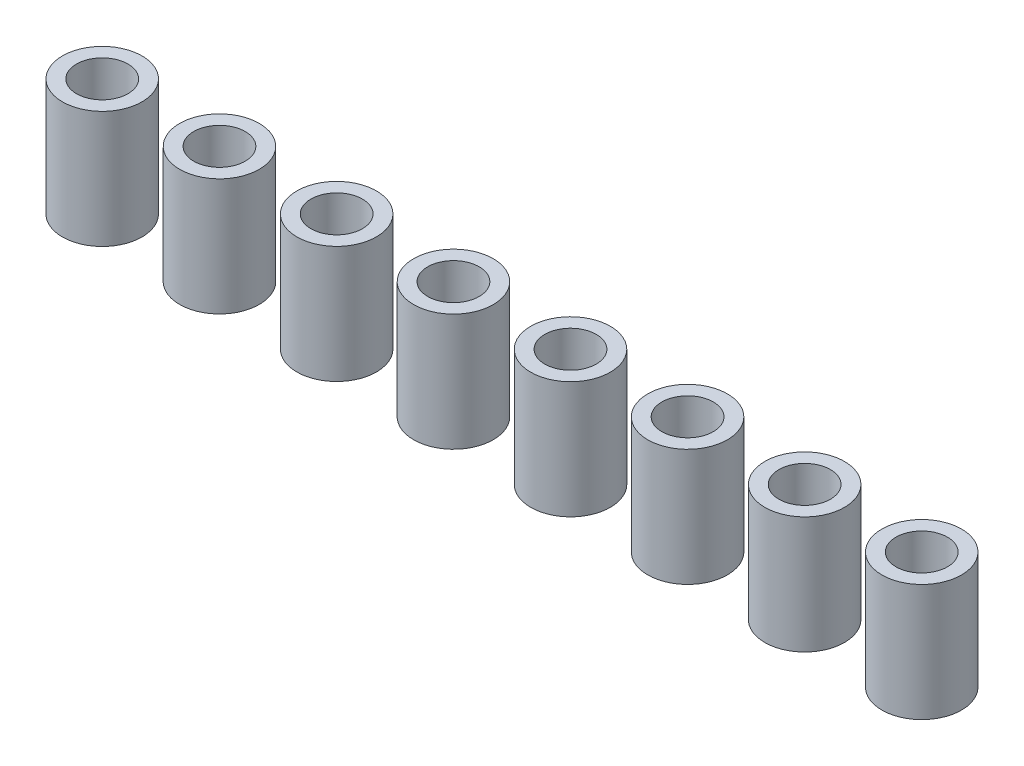
ISO-10303-21;
HEADER;
FILE_DESCRIPTION(('STEP AP214'),'2;1');
FILE_NAME('part.step','',(''),(''),'','','');
FILE_SCHEMA(('AUTOMOTIVE_DESIGN { 1 0 10303 214 1 1 1 1 }'));
ENDSEC;
DATA;
#1=APPLICATION_CONTEXT('core data for automotive mechanical design processes');
#2=APPLICATION_PROTOCOL_DEFINITION('international standard','automotive_design',2000,#1);
#3=PRODUCT_CONTEXT('',#1,'mechanical');
#4=PRODUCT('Part','Part','',(#3));
#5=PRODUCT_RELATED_PRODUCT_CATEGORY('part','',(#4));
#6=PRODUCT_DEFINITION_FORMATION('','',#4);
#7=PRODUCT_DEFINITION_CONTEXT('part definition',#1,'design');
#8=PRODUCT_DEFINITION('design','',#6,#7);
#9=PRODUCT_DEFINITION_SHAPE('','',#8);
#10=(LENGTH_UNIT() NAMED_UNIT(*) SI_UNIT(.MILLI.,.METRE.));
#11=(NAMED_UNIT(*) PLANE_ANGLE_UNIT() SI_UNIT($,.RADIAN.));
#12=(NAMED_UNIT(*) SI_UNIT($,.STERADIAN.) SOLID_ANGLE_UNIT());
#13=UNCERTAINTY_MEASURE_WITH_UNIT(LENGTH_MEASURE(1.E-05),#10,'distance_accuracy_value','');
#14=(GEOMETRIC_REPRESENTATION_CONTEXT(3) GLOBAL_UNCERTAINTY_ASSIGNED_CONTEXT((#13)) GLOBAL_UNIT_ASSIGNED_CONTEXT((#10,
#11,#12)) REPRESENTATION_CONTEXT('',''));
#15=CARTESIAN_POINT('',(0.,0.,0.));
#16=DIRECTION('',(0.,0.,1.));
#17=DIRECTION('',(1.,0.,0.));
#18=AXIS2_PLACEMENT_3D('',#15,#16,#17);
#19=CARTESIAN_POINT('',(35.,5.,0.));
#20=DIRECTION('',(0.,1.,0.));
#21=DIRECTION('',(0.,0.,1.));
#22=AXIS2_PLACEMENT_3D('',#19,#20,#21);
#23=PLANE('',#22);
#24=CARTESIAN_POINT('',(35.,5.,0.));
#25=DIRECTION('',(0.,1.,0.));
#26=DIRECTION('',(0.,0.,1.));
#27=AXIS2_PLACEMENT_3D('',#24,#25,#26);
#28=CIRCLE('',#27,1.7);
#29=CARTESIAN_POINT('',(35.,5.,1.7));
#30=VERTEX_POINT('',#29);
#31=EDGE_CURVE('E69',#30,#30,#28,.T.);
#32=ORIENTED_EDGE('',*,*,#31,.T.);
#33=EDGE_LOOP('',(#32));
#34=FACE_BOUND('',#33,.T.);
#35=CARTESIAN_POINT('',(35.,5.,0.));
#36=DIRECTION('',(0.,1.,0.));
#37=DIRECTION('',(0.,0.,1.));
#38=AXIS2_PLACEMENT_3D('',#35,#36,#37);
#39=CIRCLE('',#38,1.1);
#40=CARTESIAN_POINT('',(35.,5.,1.1));
#41=VERTEX_POINT('',#40);
#42=EDGE_CURVE('E56',#41,#41,#39,.T.);
#43=ORIENTED_EDGE('',*,*,#42,.F.);
#44=EDGE_LOOP('',(#43));
#45=FACE_BOUND('',#44,.T.);
#46=ADVANCED_FACE('F52',(#34,#45),#23,.T.);
#47=CARTESIAN_POINT('',(35.,0.,0.));
#48=DIRECTION('',(0.,1.,0.));
#49=DIRECTION('',(0.,0.,1.));
#50=AXIS2_PLACEMENT_3D('',#47,#48,#49);
#51=PLANE('',#50);
#52=CARTESIAN_POINT('',(35.,0.,0.));
#53=DIRECTION('',(0.,1.,0.));
#54=DIRECTION('',(0.,0.,1.));
#55=AXIS2_PLACEMENT_3D('',#52,#53,#54);
#56=CIRCLE('',#55,1.7);
#57=CARTESIAN_POINT('',(35.,0.,1.7));
#58=VERTEX_POINT('',#57);
#59=EDGE_CURVE('E67',#58,#58,#56,.T.);
#60=ORIENTED_EDGE('',*,*,#59,.F.);
#61=EDGE_LOOP('',(#60));
#62=FACE_BOUND('',#61,.T.);
#63=CARTESIAN_POINT('',(35.,0.,0.));
#64=DIRECTION('',(0.,1.,0.));
#65=DIRECTION('',(0.,0.,1.));
#66=AXIS2_PLACEMENT_3D('',#63,#64,#65);
#67=CIRCLE('',#66,1.1);
#68=CARTESIAN_POINT('',(35.,0.,1.1));
#69=VERTEX_POINT('',#68);
#70=EDGE_CURVE('E11',#69,#69,#67,.T.);
#71=ORIENTED_EDGE('',*,*,#70,.T.);
#72=EDGE_LOOP('',(#71));
#73=FACE_BOUND('',#72,.T.);
#74=ADVANCED_FACE('F77',(#62,#73),#51,.F.);
#75=CARTESIAN_POINT('',(35.,5.,0.));
#76=DIRECTION('',(0.,-1.,0.));
#77=DIRECTION('',(0.,0.,-1.));
#78=AXIS2_PLACEMENT_3D('',#75,#76,#77);
#79=CYLINDRICAL_SURFACE('',#78,1.7);
#80=ORIENTED_EDGE('',*,*,#31,.F.);
#81=EDGE_LOOP('',(#80));
#82=FACE_BOUND('',#81,.T.);
#83=ORIENTED_EDGE('',*,*,#59,.T.);
#84=EDGE_LOOP('',(#83));
#85=FACE_BOUND('',#84,.T.);
#86=ADVANCED_FACE('F75',(#82,#85),#79,.T.);
#87=CARTESIAN_POINT('',(35.,5.,0.));
#88=DIRECTION('',(0.,-1.,0.));
#89=DIRECTION('',(0.,0.,-1.));
#90=AXIS2_PLACEMENT_3D('',#87,#88,#89);
#91=CYLINDRICAL_SURFACE('',#90,1.1);
#92=ORIENTED_EDGE('',*,*,#42,.T.);
#93=EDGE_LOOP('',(#92));
#94=FACE_BOUND('',#93,.T.);
#95=ORIENTED_EDGE('',*,*,#70,.F.);
#96=EDGE_LOOP('',(#95));
#97=FACE_BOUND('',#96,.T.);
#98=ADVANCED_FACE('F54',(#94,#97),#91,.F.);
#99=CLOSED_SHELL('',(#46,#74,#86,#98));
#100=MANIFOLD_SOLID_BREP('B2',#99);
#101=CARTESIAN_POINT('',(30.,5.,0.));
#102=DIRECTION('',(0.,1.,0.));
#103=DIRECTION('',(0.,0.,1.));
#104=AXIS2_PLACEMENT_3D('',#101,#102,#103);
#105=PLANE('',#104);
#106=CARTESIAN_POINT('',(30.,5.,0.));
#107=DIRECTION('',(0.,1.,0.));
#108=DIRECTION('',(0.,0.,1.));
#109=AXIS2_PLACEMENT_3D('',#106,#107,#108);
#110=CIRCLE('',#109,1.7);
#111=CARTESIAN_POINT('',(30.,5.,1.7));
#112=VERTEX_POINT('',#111);
#113=EDGE_CURVE('E154',#112,#112,#110,.T.);
#114=ORIENTED_EDGE('',*,*,#113,.T.);
#115=EDGE_LOOP('',(#114));
#116=FACE_BOUND('',#115,.T.);
#117=CARTESIAN_POINT('',(30.,5.,0.));
#118=DIRECTION('',(0.,1.,0.));
#119=DIRECTION('',(0.,0.,1.));
#120=AXIS2_PLACEMENT_3D('',#117,#118,#119);
#121=CIRCLE('',#120,1.1);
#122=CARTESIAN_POINT('',(30.,5.,1.1));
#123=VERTEX_POINT('',#122);
#124=EDGE_CURVE('E142',#123,#123,#121,.T.);
#125=ORIENTED_EDGE('',*,*,#124,.F.);
#126=EDGE_LOOP('',(#125));
#127=FACE_BOUND('',#126,.T.);
#128=ADVANCED_FACE('F138',(#116,#127),#105,.T.);
#129=CARTESIAN_POINT('',(30.,0.,0.));
#130=DIRECTION('',(0.,1.,0.));
#131=DIRECTION('',(0.,0.,1.));
#132=AXIS2_PLACEMENT_3D('',#129,#130,#131);
#133=PLANE('',#132);
#134=CARTESIAN_POINT('',(30.,0.,0.));
#135=DIRECTION('',(0.,1.,0.));
#136=DIRECTION('',(0.,0.,1.));
#137=AXIS2_PLACEMENT_3D('',#134,#135,#136);
#138=CIRCLE('',#137,1.7);
#139=CARTESIAN_POINT('',(30.,0.,1.7));
#140=VERTEX_POINT('',#139);
#141=EDGE_CURVE('E152',#140,#140,#138,.T.);
#142=ORIENTED_EDGE('',*,*,#141,.F.);
#143=EDGE_LOOP('',(#142));
#144=FACE_BOUND('',#143,.T.);
#145=CARTESIAN_POINT('',(30.,0.,0.));
#146=DIRECTION('',(0.,1.,0.));
#147=DIRECTION('',(0.,0.,1.));
#148=AXIS2_PLACEMENT_3D('',#145,#146,#147);
#149=CIRCLE('',#148,1.1);
#150=CARTESIAN_POINT('',(30.,0.,1.1));
#151=VERTEX_POINT('',#150);
#152=EDGE_CURVE('E51',#151,#151,#149,.T.);
#153=ORIENTED_EDGE('',*,*,#152,.T.);
#154=EDGE_LOOP('',(#153));
#155=FACE_BOUND('',#154,.T.);
#156=ADVANCED_FACE('F163',(#144,#155),#133,.F.);
#157=CARTESIAN_POINT('',(30.,5.,0.));
#158=DIRECTION('',(0.,-1.,0.));
#159=DIRECTION('',(0.,0.,-1.));
#160=AXIS2_PLACEMENT_3D('',#157,#158,#159);
#161=CYLINDRICAL_SURFACE('',#160,1.7);
#162=ORIENTED_EDGE('',*,*,#113,.F.);
#163=EDGE_LOOP('',(#162));
#164=FACE_BOUND('',#163,.T.);
#165=ORIENTED_EDGE('',*,*,#141,.T.);
#166=EDGE_LOOP('',(#165));
#167=FACE_BOUND('',#166,.T.);
#168=ADVANCED_FACE('F161',(#164,#167),#161,.T.);
#169=CARTESIAN_POINT('',(30.,5.,0.));
#170=DIRECTION('',(0.,-1.,0.));
#171=DIRECTION('',(0.,0.,-1.));
#172=AXIS2_PLACEMENT_3D('',#169,#170,#171);
#173=CYLINDRICAL_SURFACE('',#172,1.1);
#174=ORIENTED_EDGE('',*,*,#124,.T.);
#175=EDGE_LOOP('',(#174));
#176=FACE_BOUND('',#175,.T.);
#177=ORIENTED_EDGE('',*,*,#152,.F.);
#178=EDGE_LOOP('',(#177));
#179=FACE_BOUND('',#178,.T.);
#180=ADVANCED_FACE('F140',(#176,#179),#173,.F.);
#181=CLOSED_SHELL('',(#128,#156,#168,#180));
#182=MANIFOLD_SOLID_BREP('B6',#181);
#183=CARTESIAN_POINT('',(25.,5.,0.));
#184=DIRECTION('',(0.,1.,0.));
#185=DIRECTION('',(0.,0.,1.));
#186=AXIS2_PLACEMENT_3D('',#183,#184,#185);
#187=PLANE('',#186);
#188=CARTESIAN_POINT('',(25.,5.,0.));
#189=DIRECTION('',(0.,1.,0.));
#190=DIRECTION('',(0.,0.,1.));
#191=AXIS2_PLACEMENT_3D('',#188,#189,#190);
#192=CIRCLE('',#191,1.7);
#193=CARTESIAN_POINT('',(25.,5.,1.7));
#194=VERTEX_POINT('',#193);
#195=EDGE_CURVE('E240',#194,#194,#192,.T.);
#196=ORIENTED_EDGE('',*,*,#195,.T.);
#197=EDGE_LOOP('',(#196));
#198=FACE_BOUND('',#197,.T.);
#199=CARTESIAN_POINT('',(25.,5.,0.));
#200=DIRECTION('',(0.,1.,0.));
#201=DIRECTION('',(0.,0.,1.));
#202=AXIS2_PLACEMENT_3D('',#199,#200,#201);
#203=CIRCLE('',#202,1.1);
#204=CARTESIAN_POINT('',(25.,5.,1.1));
#205=VERTEX_POINT('',#204);
#206=EDGE_CURVE('E228',#205,#205,#203,.T.);
#207=ORIENTED_EDGE('',*,*,#206,.F.);
#208=EDGE_LOOP('',(#207));
#209=FACE_BOUND('',#208,.T.);
#210=ADVANCED_FACE('F224',(#198,#209),#187,.T.);
#211=CARTESIAN_POINT('',(25.,0.,0.));
#212=DIRECTION('',(0.,1.,0.));
#213=DIRECTION('',(0.,0.,1.));
#214=AXIS2_PLACEMENT_3D('',#211,#212,#213);
#215=PLANE('',#214);
#216=CARTESIAN_POINT('',(25.,0.,0.));
#217=DIRECTION('',(0.,1.,0.));
#218=DIRECTION('',(0.,0.,1.));
#219=AXIS2_PLACEMENT_3D('',#216,#217,#218);
#220=CIRCLE('',#219,1.7);
#221=CARTESIAN_POINT('',(25.,0.,1.7));
#222=VERTEX_POINT('',#221);
#223=EDGE_CURVE('E238',#222,#222,#220,.T.);
#224=ORIENTED_EDGE('',*,*,#223,.F.);
#225=EDGE_LOOP('',(#224));
#226=FACE_BOUND('',#225,.T.);
#227=CARTESIAN_POINT('',(25.,0.,0.));
#228=DIRECTION('',(0.,1.,0.));
#229=DIRECTION('',(0.,0.,1.));
#230=AXIS2_PLACEMENT_3D('',#227,#228,#229);
#231=CIRCLE('',#230,1.1);
#232=CARTESIAN_POINT('',(25.,0.,1.1));
#233=VERTEX_POINT('',#232);
#234=EDGE_CURVE('E137',#233,#233,#231,.T.);
#235=ORIENTED_EDGE('',*,*,#234,.T.);
#236=EDGE_LOOP('',(#235));
#237=FACE_BOUND('',#236,.T.);
#238=ADVANCED_FACE('F249',(#226,#237),#215,.F.);
#239=CARTESIAN_POINT('',(25.,5.,0.));
#240=DIRECTION('',(0.,-1.,0.));
#241=DIRECTION('',(0.,0.,-1.));
#242=AXIS2_PLACEMENT_3D('',#239,#240,#241);
#243=CYLINDRICAL_SURFACE('',#242,1.7);
#244=ORIENTED_EDGE('',*,*,#195,.F.);
#245=EDGE_LOOP('',(#244));
#246=FACE_BOUND('',#245,.T.);
#247=ORIENTED_EDGE('',*,*,#223,.T.);
#248=EDGE_LOOP('',(#247));
#249=FACE_BOUND('',#248,.T.);
#250=ADVANCED_FACE('F247',(#246,#249),#243,.T.);
#251=CARTESIAN_POINT('',(25.,5.,0.));
#252=DIRECTION('',(0.,-1.,0.));
#253=DIRECTION('',(0.,0.,-1.));
#254=AXIS2_PLACEMENT_3D('',#251,#252,#253);
#255=CYLINDRICAL_SURFACE('',#254,1.1);
#256=ORIENTED_EDGE('',*,*,#206,.T.);
#257=EDGE_LOOP('',(#256));
#258=FACE_BOUND('',#257,.T.);
#259=ORIENTED_EDGE('',*,*,#234,.F.);
#260=EDGE_LOOP('',(#259));
#261=FACE_BOUND('',#260,.T.);
#262=ADVANCED_FACE('F226',(#258,#261),#255,.F.);
#263=CLOSED_SHELL('',(#210,#238,#250,#262));
#264=MANIFOLD_SOLID_BREP('B46',#263);
#265=CARTESIAN_POINT('',(20.,5.,0.));
#266=DIRECTION('',(0.,1.,0.));
#267=DIRECTION('',(0.,0.,1.));
#268=AXIS2_PLACEMENT_3D('',#265,#266,#267);
#269=PLANE('',#268);
#270=CARTESIAN_POINT('',(20.,5.,0.));
#271=DIRECTION('',(0.,1.,0.));
#272=DIRECTION('',(0.,0.,1.));
#273=AXIS2_PLACEMENT_3D('',#270,#271,#272);
#274=CIRCLE('',#273,1.7);
#275=CARTESIAN_POINT('',(20.,5.,1.7));
#276=VERTEX_POINT('',#275);
#277=EDGE_CURVE('E327',#276,#276,#274,.T.);
#278=ORIENTED_EDGE('',*,*,#277,.T.);
#279=EDGE_LOOP('',(#278));
#280=FACE_BOUND('',#279,.T.);
#281=CARTESIAN_POINT('',(20.,5.,0.));
#282=DIRECTION('',(0.,1.,0.));
#283=DIRECTION('',(0.,0.,1.));
#284=AXIS2_PLACEMENT_3D('',#281,#282,#283);
#285=CIRCLE('',#284,1.1);
#286=CARTESIAN_POINT('',(20.,5.,1.1));
#287=VERTEX_POINT('',#286);
#288=EDGE_CURVE('E314',#287,#287,#285,.T.);
#289=ORIENTED_EDGE('',*,*,#288,.F.);
#290=EDGE_LOOP('',(#289));
#291=FACE_BOUND('',#290,.T.);
#292=ADVANCED_FACE('F310',(#280,#291),#269,.T.);
#293=CARTESIAN_POINT('',(20.,0.,0.));
#294=DIRECTION('',(0.,1.,0.));
#295=DIRECTION('',(0.,0.,1.));
#296=AXIS2_PLACEMENT_3D('',#293,#294,#295);
#297=PLANE('',#296);
#298=CARTESIAN_POINT('',(20.,0.,0.));
#299=DIRECTION('',(0.,1.,0.));
#300=DIRECTION('',(0.,0.,1.));
#301=AXIS2_PLACEMENT_3D('',#298,#299,#300);
#302=CIRCLE('',#301,1.7);
#303=CARTESIAN_POINT('',(20.,0.,1.7));
#304=VERTEX_POINT('',#303);
#305=EDGE_CURVE('E325',#304,#304,#302,.T.);
#306=ORIENTED_EDGE('',*,*,#305,.F.);
#307=EDGE_LOOP('',(#306));
#308=FACE_BOUND('',#307,.T.);
#309=CARTESIAN_POINT('',(20.,0.,0.));
#310=DIRECTION('',(0.,1.,0.));
#311=DIRECTION('',(0.,0.,1.));
#312=AXIS2_PLACEMENT_3D('',#309,#310,#311);
#313=CIRCLE('',#312,1.1);
#314=CARTESIAN_POINT('',(20.,0.,1.1));
#315=VERTEX_POINT('',#314);
#316=EDGE_CURVE('E223',#315,#315,#313,.T.);
#317=ORIENTED_EDGE('',*,*,#316,.T.);
#318=EDGE_LOOP('',(#317));
#319=FACE_BOUND('',#318,.T.);
#320=ADVANCED_FACE('F335',(#308,#319),#297,.F.);
#321=CARTESIAN_POINT('',(20.,5.,0.));
#322=DIRECTION('',(0.,-1.,0.));
#323=DIRECTION('',(0.,0.,-1.));
#324=AXIS2_PLACEMENT_3D('',#321,#322,#323);
#325=CYLINDRICAL_SURFACE('',#324,1.7);
#326=ORIENTED_EDGE('',*,*,#277,.F.);
#327=EDGE_LOOP('',(#326));
#328=FACE_BOUND('',#327,.T.);
#329=ORIENTED_EDGE('',*,*,#305,.T.);
#330=EDGE_LOOP('',(#329));
#331=FACE_BOUND('',#330,.T.);
#332=ADVANCED_FACE('F333',(#328,#331),#325,.T.);
#333=CARTESIAN_POINT('',(20.,5.,0.));
#334=DIRECTION('',(0.,-1.,0.));
#335=DIRECTION('',(0.,0.,-1.));
#336=AXIS2_PLACEMENT_3D('',#333,#334,#335);
#337=CYLINDRICAL_SURFACE('',#336,1.1);
#338=ORIENTED_EDGE('',*,*,#288,.T.);
#339=EDGE_LOOP('',(#338));
#340=FACE_BOUND('',#339,.T.);
#341=ORIENTED_EDGE('',*,*,#316,.F.);
#342=EDGE_LOOP('',(#341));
#343=FACE_BOUND('',#342,.T.);
#344=ADVANCED_FACE('F312',(#340,#343),#337,.F.);
#345=CLOSED_SHELL('',(#292,#320,#332,#344));
#346=MANIFOLD_SOLID_BREP('B132',#345);
#347=CARTESIAN_POINT('',(15.,5.,0.));
#348=DIRECTION('',(0.,1.,0.));
#349=DIRECTION('',(0.,0.,1.));
#350=AXIS2_PLACEMENT_3D('',#347,#348,#349);
#351=PLANE('',#350);
#352=CARTESIAN_POINT('',(15.,5.,0.));
#353=DIRECTION('',(0.,1.,0.));
#354=DIRECTION('',(0.,0.,1.));
#355=AXIS2_PLACEMENT_3D('',#352,#353,#354);
#356=CIRCLE('',#355,1.7);
#357=CARTESIAN_POINT('',(15.,5.,1.7));
#358=VERTEX_POINT('',#357);
#359=EDGE_CURVE('E413',#358,#358,#356,.T.);
#360=ORIENTED_EDGE('',*,*,#359,.T.);
#361=EDGE_LOOP('',(#360));
#362=FACE_BOUND('',#361,.T.);
#363=CARTESIAN_POINT('',(15.,5.,0.));
#364=DIRECTION('',(0.,1.,0.));
#365=DIRECTION('',(0.,0.,1.));
#366=AXIS2_PLACEMENT_3D('',#363,#364,#365);
#367=CIRCLE('',#366,1.1);
#368=CARTESIAN_POINT('',(15.,5.,1.1));
#369=VERTEX_POINT('',#368);
#370=EDGE_CURVE('E400',#369,#369,#367,.T.);
#371=ORIENTED_EDGE('',*,*,#370,.F.);
#372=EDGE_LOOP('',(#371));
#373=FACE_BOUND('',#372,.T.);
#374=ADVANCED_FACE('F396',(#362,#373),#351,.T.);
#375=CARTESIAN_POINT('',(15.,0.,0.));
#376=DIRECTION('',(0.,1.,0.));
#377=DIRECTION('',(0.,0.,1.));
#378=AXIS2_PLACEMENT_3D('',#375,#376,#377);
#379=PLANE('',#378);
#380=CARTESIAN_POINT('',(15.,0.,0.));
#381=DIRECTION('',(0.,1.,0.));
#382=DIRECTION('',(0.,0.,1.));
#383=AXIS2_PLACEMENT_3D('',#380,#381,#382);
#384=CIRCLE('',#383,1.7);
#385=CARTESIAN_POINT('',(15.,0.,1.7));
#386=VERTEX_POINT('',#385);
#387=EDGE_CURVE('E411',#386,#386,#384,.T.);
#388=ORIENTED_EDGE('',*,*,#387,.F.);
#389=EDGE_LOOP('',(#388));
#390=FACE_BOUND('',#389,.T.);
#391=CARTESIAN_POINT('',(15.,0.,0.));
#392=DIRECTION('',(0.,1.,0.));
#393=DIRECTION('',(0.,0.,1.));
#394=AXIS2_PLACEMENT_3D('',#391,#392,#393);
#395=CIRCLE('',#394,1.1);
#396=CARTESIAN_POINT('',(15.,0.,1.1));
#397=VERTEX_POINT('',#396);
#398=EDGE_CURVE('E309',#397,#397,#395,.T.);
#399=ORIENTED_EDGE('',*,*,#398,.T.);
#400=EDGE_LOOP('',(#399));
#401=FACE_BOUND('',#400,.T.);
#402=ADVANCED_FACE('F421',(#390,#401),#379,.F.);
#403=CARTESIAN_POINT('',(15.,5.,0.));
#404=DIRECTION('',(0.,-1.,0.));
#405=DIRECTION('',(0.,0.,-1.));
#406=AXIS2_PLACEMENT_3D('',#403,#404,#405);
#407=CYLINDRICAL_SURFACE('',#406,1.7);
#408=ORIENTED_EDGE('',*,*,#359,.F.);
#409=EDGE_LOOP('',(#408));
#410=FACE_BOUND('',#409,.T.);
#411=ORIENTED_EDGE('',*,*,#387,.T.);
#412=EDGE_LOOP('',(#411));
#413=FACE_BOUND('',#412,.T.);
#414=ADVANCED_FACE('F419',(#410,#413),#407,.T.);
#415=CARTESIAN_POINT('',(15.,5.,0.));
#416=DIRECTION('',(0.,-1.,0.));
#417=DIRECTION('',(0.,0.,-1.));
#418=AXIS2_PLACEMENT_3D('',#415,#416,#417);
#419=CYLINDRICAL_SURFACE('',#418,1.1);
#420=ORIENTED_EDGE('',*,*,#370,.T.);
#421=EDGE_LOOP('',(#420));
#422=FACE_BOUND('',#421,.T.);
#423=ORIENTED_EDGE('',*,*,#398,.F.);
#424=EDGE_LOOP('',(#423));
#425=FACE_BOUND('',#424,.T.);
#426=ADVANCED_FACE('F398',(#422,#425),#419,.F.);
#427=CLOSED_SHELL('',(#374,#402,#414,#426));
#428=MANIFOLD_SOLID_BREP('B218',#427);
#429=CARTESIAN_POINT('',(10.,5.,-0.0122355309840162));
#430=DIRECTION('',(0.,1.,0.));
#431=DIRECTION('',(0.,0.,1.));
#432=AXIS2_PLACEMENT_3D('',#429,#430,#431);
#433=PLANE('',#432);
#434=CARTESIAN_POINT('',(10.,5.,-0.0122355309840162));
#435=DIRECTION('',(0.,1.,0.));
#436=DIRECTION('',(0.,0.,1.));
#437=AXIS2_PLACEMENT_3D('',#434,#435,#436);
#438=CIRCLE('',#437,1.7);
#439=CARTESIAN_POINT('',(10.,5.,1.68776446901598));
#440=VERTEX_POINT('',#439);
#441=EDGE_CURVE('E498',#440,#440,#438,.T.);
#442=ORIENTED_EDGE('',*,*,#441,.T.);
#443=EDGE_LOOP('',(#442));
#444=FACE_BOUND('',#443,.T.);
#445=CARTESIAN_POINT('',(10.,5.,-0.0122355309840162));
#446=DIRECTION('',(0.,1.,0.));
#447=DIRECTION('',(0.,0.,1.));
#448=AXIS2_PLACEMENT_3D('',#445,#446,#447);
#449=CIRCLE('',#448,1.1);
#450=CARTESIAN_POINT('',(10.,5.,1.08776446901598));
#451=VERTEX_POINT('',#450);
#452=EDGE_CURVE('E486',#451,#451,#449,.T.);
#453=ORIENTED_EDGE('',*,*,#452,.F.);
#454=EDGE_LOOP('',(#453));
#455=FACE_BOUND('',#454,.T.);
#456=ADVANCED_FACE('F482',(#444,#455),#433,.T.);
#457=CARTESIAN_POINT('',(10.,0.,-0.0122355309840162));
#458=DIRECTION('',(0.,1.,0.));
#459=DIRECTION('',(0.,0.,1.));
#460=AXIS2_PLACEMENT_3D('',#457,#458,#459);
#461=PLANE('',#460);
#462=CARTESIAN_POINT('',(10.,0.,-0.0122355309840162));
#463=DIRECTION('',(0.,1.,0.));
#464=DIRECTION('',(0.,0.,1.));
#465=AXIS2_PLACEMENT_3D('',#462,#463,#464);
#466=CIRCLE('',#465,1.7);
#467=CARTESIAN_POINT('',(10.,0.,1.68776446901598));
#468=VERTEX_POINT('',#467);
#469=EDGE_CURVE('E496',#468,#468,#466,.T.);
#470=ORIENTED_EDGE('',*,*,#469,.F.);
#471=EDGE_LOOP('',(#470));
#472=FACE_BOUND('',#471,.T.);
#473=CARTESIAN_POINT('',(10.,0.,-0.0122355309840162));
#474=DIRECTION('',(0.,1.,0.));
#475=DIRECTION('',(0.,0.,1.));
#476=AXIS2_PLACEMENT_3D('',#473,#474,#475);
#477=CIRCLE('',#476,1.1);
#478=CARTESIAN_POINT('',(10.,0.,1.08776446901598));
#479=VERTEX_POINT('',#478);
#480=EDGE_CURVE('E395',#479,#479,#477,.T.);
#481=ORIENTED_EDGE('',*,*,#480,.T.);
#482=EDGE_LOOP('',(#481));
#483=FACE_BOUND('',#482,.T.);
#484=ADVANCED_FACE('F507',(#472,#483),#461,.F.);
#485=CARTESIAN_POINT('',(10.,5.,-0.0122355309840162));
#486=DIRECTION('',(0.,-1.,0.));
#487=DIRECTION('',(0.,0.,-1.));
#488=AXIS2_PLACEMENT_3D('',#485,#486,#487);
#489=CYLINDRICAL_SURFACE('',#488,1.7);
#490=ORIENTED_EDGE('',*,*,#441,.F.);
#491=EDGE_LOOP('',(#490));
#492=FACE_BOUND('',#491,.T.);
#493=ORIENTED_EDGE('',*,*,#469,.T.);
#494=EDGE_LOOP('',(#493));
#495=FACE_BOUND('',#494,.T.);
#496=ADVANCED_FACE('F505',(#492,#495),#489,.T.);
#497=CARTESIAN_POINT('',(10.,5.,-0.0122355309840162));
#498=DIRECTION('',(0.,-1.,0.));
#499=DIRECTION('',(0.,0.,-1.));
#500=AXIS2_PLACEMENT_3D('',#497,#498,#499);
#501=CYLINDRICAL_SURFACE('',#500,1.1);
#502=ORIENTED_EDGE('',*,*,#452,.T.);
#503=EDGE_LOOP('',(#502));
#504=FACE_BOUND('',#503,.T.);
#505=ORIENTED_EDGE('',*,*,#480,.F.);
#506=EDGE_LOOP('',(#505));
#507=FACE_BOUND('',#506,.T.);
#508=ADVANCED_FACE('F484',(#504,#507),#501,.F.);
#509=CLOSED_SHELL('',(#456,#484,#496,#508));
#510=MANIFOLD_SOLID_BREP('B304',#509);
#511=CARTESIAN_POINT('',(5.,5.,-0.00708074709768865));
#512=DIRECTION('',(0.,1.,0.));
#513=DIRECTION('',(0.,0.,1.));
#514=AXIS2_PLACEMENT_3D('',#511,#512,#513);
#515=PLANE('',#514);
#516=CARTESIAN_POINT('',(5.,5.,-0.00708074709768865));
#517=DIRECTION('',(0.,1.,0.));
#518=DIRECTION('',(0.,0.,1.));
#519=AXIS2_PLACEMENT_3D('',#516,#517,#518);
#520=CIRCLE('',#519,1.7);
#521=CARTESIAN_POINT('',(5.,5.,1.69291925290231));
#522=VERTEX_POINT('',#521);
#523=EDGE_CURVE('E582',#522,#522,#520,.T.);
#524=ORIENTED_EDGE('',*,*,#523,.T.);
#525=EDGE_LOOP('',(#524));
#526=FACE_BOUND('',#525,.T.);
#527=CARTESIAN_POINT('',(5.,5.,-0.00708074709768865));
#528=DIRECTION('',(0.,1.,0.));
#529=DIRECTION('',(0.,0.,1.));
#530=AXIS2_PLACEMENT_3D('',#527,#528,#529);
#531=CIRCLE('',#530,1.1);
#532=CARTESIAN_POINT('',(5.,5.,1.09291925290231));
#533=VERTEX_POINT('',#532);
#534=EDGE_CURVE('E571',#533,#533,#531,.T.);
#535=ORIENTED_EDGE('',*,*,#534,.F.);
#536=EDGE_LOOP('',(#535));
#537=FACE_BOUND('',#536,.T.);
#538=ADVANCED_FACE('F567',(#526,#537),#515,.T.);
#539=CARTESIAN_POINT('',(5.,0.,-0.00708074709768865));
#540=DIRECTION('',(0.,1.,0.));
#541=DIRECTION('',(0.,0.,1.));
#542=AXIS2_PLACEMENT_3D('',#539,#540,#541);
#543=PLANE('',#542);
#544=CARTESIAN_POINT('',(5.,0.,-0.00708074709768865));
#545=DIRECTION('',(0.,1.,0.));
#546=DIRECTION('',(0.,0.,1.));
#547=AXIS2_PLACEMENT_3D('',#544,#545,#546);
#548=CIRCLE('',#547,1.7);
#549=CARTESIAN_POINT('',(5.,0.,1.69291925290231));
#550=VERTEX_POINT('',#549);
#551=EDGE_CURVE('E580',#550,#550,#548,.T.);
#552=ORIENTED_EDGE('',*,*,#551,.F.);
#553=EDGE_LOOP('',(#552));
#554=FACE_BOUND('',#553,.T.);
#555=CARTESIAN_POINT('',(5.,0.,-0.00708074709768865));
#556=DIRECTION('',(0.,1.,0.));
#557=DIRECTION('',(0.,0.,1.));
#558=AXIS2_PLACEMENT_3D('',#555,#556,#557);
#559=CIRCLE('',#558,1.1);
#560=CARTESIAN_POINT('',(5.,0.,1.09291925290231));
#561=VERTEX_POINT('',#560);
#562=EDGE_CURVE('E481',#561,#561,#559,.T.);
#563=ORIENTED_EDGE('',*,*,#562,.T.);
#564=EDGE_LOOP('',(#563));
#565=FACE_BOUND('',#564,.T.);
#566=ADVANCED_FACE('F592',(#554,#565),#543,.F.);
#567=CARTESIAN_POINT('',(5.,5.,-0.00708074709768865));
#568=DIRECTION('',(0.,-1.,0.));
#569=DIRECTION('',(0.,0.,-1.));
#570=AXIS2_PLACEMENT_3D('',#567,#568,#569);
#571=CYLINDRICAL_SURFACE('',#570,1.7);
#572=ORIENTED_EDGE('',*,*,#523,.F.);
#573=EDGE_LOOP('',(#572));
#574=FACE_BOUND('',#573,.T.);
#575=ORIENTED_EDGE('',*,*,#551,.T.);
#576=EDGE_LOOP('',(#575));
#577=FACE_BOUND('',#576,.T.);
#578=ADVANCED_FACE('F590',(#574,#577),#571,.T.);
#579=CARTESIAN_POINT('',(5.,5.,-0.00708074709768865));
#580=DIRECTION('',(0.,-1.,0.));
#581=DIRECTION('',(0.,0.,-1.));
#582=AXIS2_PLACEMENT_3D('',#579,#580,#581);
#583=CYLINDRICAL_SURFACE('',#582,1.1);
#584=ORIENTED_EDGE('',*,*,#534,.T.);
#585=EDGE_LOOP('',(#584));
#586=FACE_BOUND('',#585,.T.);
#587=ORIENTED_EDGE('',*,*,#562,.F.);
#588=EDGE_LOOP('',(#587));
#589=FACE_BOUND('',#588,.T.);
#590=ADVANCED_FACE('F569',(#586,#589),#583,.F.);
#591=CLOSED_SHELL('',(#538,#566,#578,#590));
#592=MANIFOLD_SOLID_BREP('B390',#591);
#593=CARTESIAN_POINT('',(0.,5.,0.));
#594=DIRECTION('',(0.,1.,0.));
#595=DIRECTION('',(0.,0.,1.));
#596=AXIS2_PLACEMENT_3D('',#593,#594,#595);
#597=PLANE('',#596);
#598=CARTESIAN_POINT('',(0.,5.,0.));
#599=DIRECTION('',(0.,1.,0.));
#600=DIRECTION('',(0.,0.,1.));
#601=AXIS2_PLACEMENT_3D('',#598,#599,#600);
#602=CIRCLE('',#601,1.7);
#603=CARTESIAN_POINT('',(0.,5.,1.7));
#604=VERTEX_POINT('',#603);
#605=EDGE_CURVE('E566',#604,#604,#602,.T.);
#606=ORIENTED_EDGE('',*,*,#605,.T.);
#607=EDGE_LOOP('',(#606));
#608=FACE_BOUND('',#607,.T.);
#609=CARTESIAN_POINT('',(0.,5.,0.));
#610=DIRECTION('',(0.,1.,0.));
#611=DIRECTION('',(0.,0.,1.));
#612=AXIS2_PLACEMENT_3D('',#609,#610,#611);
#613=CIRCLE('',#612,1.1);
#614=CARTESIAN_POINT('',(0.,5.,1.1));
#615=VERTEX_POINT('',#614);
#616=EDGE_CURVE('E659',#615,#615,#613,.T.);
#617=ORIENTED_EDGE('',*,*,#616,.F.);
#618=EDGE_LOOP('',(#617));
#619=FACE_BOUND('',#618,.T.);
#620=ADVANCED_FACE('F645',(#608,#619),#597,.T.);
#621=CARTESIAN_POINT('',(0.,0.,0.));
#622=DIRECTION('',(0.,1.,0.));
#623=DIRECTION('',(0.,0.,1.));
#624=AXIS2_PLACEMENT_3D('',#621,#622,#623);
#625=PLANE('',#624);
#626=CARTESIAN_POINT('',(0.,0.,0.));
#627=DIRECTION('',(0.,1.,0.));
#628=DIRECTION('',(0.,0.,1.));
#629=AXIS2_PLACEMENT_3D('',#626,#627,#628);
#630=CIRCLE('',#629,1.7);
#631=CARTESIAN_POINT('',(0.,0.,1.7));
#632=VERTEX_POINT('',#631);
#633=EDGE_CURVE('E649',#632,#632,#630,.T.);
#634=ORIENTED_EDGE('',*,*,#633,.F.);
#635=EDGE_LOOP('',(#634));
#636=FACE_BOUND('',#635,.T.);
#637=CARTESIAN_POINT('',(0.,0.,0.));
#638=DIRECTION('',(0.,1.,0.));
#639=DIRECTION('',(0.,0.,1.));
#640=AXIS2_PLACEMENT_3D('',#637,#638,#639);
#641=CIRCLE('',#640,1.1);
#642=CARTESIAN_POINT('',(0.,0.,1.1));
#643=VERTEX_POINT('',#642);
#644=EDGE_CURVE('E661',#643,#643,#641,.T.);
#645=ORIENTED_EDGE('',*,*,#644,.T.);
#646=EDGE_LOOP('',(#645));
#647=FACE_BOUND('',#646,.T.);
#648=ADVANCED_FACE('F672',(#636,#647),#625,.F.);
#649=CARTESIAN_POINT('',(0.,5.,0.));
#650=DIRECTION('',(0.,-1.,0.));
#651=DIRECTION('',(0.,0.,-1.));
#652=AXIS2_PLACEMENT_3D('',#649,#650,#651);
#653=CYLINDRICAL_SURFACE('',#652,1.7);
#654=ORIENTED_EDGE('',*,*,#605,.F.);
#655=EDGE_LOOP('',(#654));
#656=FACE_BOUND('',#655,.T.);
#657=ORIENTED_EDGE('',*,*,#633,.T.);
#658=EDGE_LOOP('',(#657));
#659=FACE_BOUND('',#658,.T.);
#660=ADVANCED_FACE('F647',(#656,#659),#653,.T.);
#661=CARTESIAN_POINT('',(0.,5.,0.));
#662=DIRECTION('',(0.,-1.,0.));
#663=DIRECTION('',(0.,0.,-1.));
#664=AXIS2_PLACEMENT_3D('',#661,#662,#663);
#665=CYLINDRICAL_SURFACE('',#664,1.1);
#666=ORIENTED_EDGE('',*,*,#616,.T.);
#667=EDGE_LOOP('',(#666));
#668=FACE_BOUND('',#667,.T.);
#669=ORIENTED_EDGE('',*,*,#644,.F.);
#670=EDGE_LOOP('',(#669));
#671=FACE_BOUND('',#670,.T.);
#672=ADVANCED_FACE('F668',(#668,#671),#665,.F.);
#673=CLOSED_SHELL('',(#620,#648,#660,#672));
#674=MANIFOLD_SOLID_BREP('B476',#673);
#675=ADVANCED_BREP_SHAPE_REPRESENTATION('',(#18,#100,#182,#264,#346,#428,#510,#592,#674),#14);
#676=SHAPE_DEFINITION_REPRESENTATION(#9,#675);
ENDSEC;
END-ISO-10303-21;
